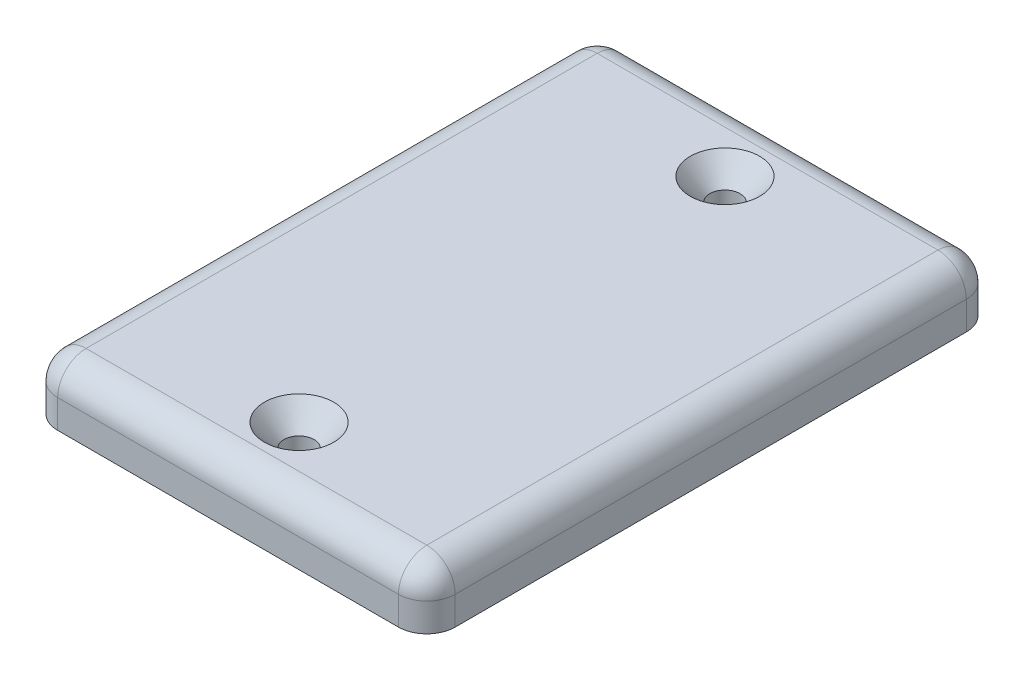
ISO-10303-21;
HEADER;
FILE_DESCRIPTION(('STEP AP214'),'2;1');
FILE_NAME('part.step','',(''),(''),'','','');
FILE_SCHEMA(('AUTOMOTIVE_DESIGN { 1 0 10303 214 1 1 1 1 }'));
ENDSEC;
DATA;
#1=APPLICATION_CONTEXT('core data for automotive mechanical design processes');
#2=APPLICATION_PROTOCOL_DEFINITION('international standard','automotive_design',2000,#1);
#3=PRODUCT_CONTEXT('',#1,'mechanical');
#4=PRODUCT('Part','Part','',(#3));
#5=PRODUCT_RELATED_PRODUCT_CATEGORY('part','',(#4));
#6=PRODUCT_DEFINITION_FORMATION('','',#4);
#7=PRODUCT_DEFINITION_CONTEXT('part definition',#1,'design');
#8=PRODUCT_DEFINITION('design','',#6,#7);
#9=PRODUCT_DEFINITION_SHAPE('','',#8);
#10=(LENGTH_UNIT() NAMED_UNIT(*) SI_UNIT(.MILLI.,.METRE.));
#11=(NAMED_UNIT(*) PLANE_ANGLE_UNIT() SI_UNIT($,.RADIAN.));
#12=(NAMED_UNIT(*) SI_UNIT($,.STERADIAN.) SOLID_ANGLE_UNIT());
#13=UNCERTAINTY_MEASURE_WITH_UNIT(LENGTH_MEASURE(1.E-05),#10,'distance_accuracy_value','');
#14=(GEOMETRIC_REPRESENTATION_CONTEXT(3) GLOBAL_UNCERTAINTY_ASSIGNED_CONTEXT((#13)) GLOBAL_UNIT_ASSIGNED_CONTEXT((#10,
#11,#12)) REPRESENTATION_CONTEXT('',''));
#15=CARTESIAN_POINT('',(0.,0.,0.));
#16=DIRECTION('',(0.,0.,1.));
#17=DIRECTION('',(1.,0.,0.));
#18=AXIS2_PLACEMENT_3D('',#15,#16,#17);
#19=CARTESIAN_POINT('',(0.,12.7,0.));
#20=DIRECTION('',(1.,0.,0.));
#21=DIRECTION('',(0.,0.,-1.));
#22=AXIS2_PLACEMENT_3D('',#19,#20,#21);
#23=PLANE('',#22);
#24=DIRECTION('',(0.,-1.,0.));
#25=VECTOR('',#24,1.);
#26=CARTESIAN_POINT('',(0.,12.7,-6.35));
#27=LINE('',#26,#25);
#28=CARTESIAN_POINT('',(0.,0.,-6.35));
#29=VERTEX_POINT('',#28);
#30=CARTESIAN_POINT('',(0.,6.35,-6.35));
#31=VERTEX_POINT('',#30);
#32=EDGE_CURVE('E130',#29,#31,#27,.F.);
#33=ORIENTED_EDGE('',*,*,#32,.T.);
#34=DIRECTION('',(0.,0.,1.));
#35=VECTOR('',#34,1.);
#36=CARTESIAN_POINT('',(0.,6.35,0.));
#37=LINE('',#36,#35);
#38=CARTESIAN_POINT('',(0.,6.35,-120.65));
#39=VERTEX_POINT('',#38);
#40=EDGE_CURVE('E58',#31,#39,#37,.F.);
#41=ORIENTED_EDGE('',*,*,#40,.T.);
#42=DIRECTION('',(0.,-1.,0.));
#43=VECTOR('',#42,1.);
#44=CARTESIAN_POINT('',(0.,12.7,-120.65));
#45=LINE('',#44,#43);
#46=CARTESIAN_POINT('',(0.,0.,-120.65));
#47=VERTEX_POINT('',#46);
#48=EDGE_CURVE('E134',#39,#47,#45,.T.);
#49=ORIENTED_EDGE('',*,*,#48,.T.);
#50=DIRECTION('',(0.,0.,1.));
#51=VECTOR('',#50,1.);
#52=CARTESIAN_POINT('',(0.,0.,0.));
#53=LINE('',#52,#51);
#54=EDGE_CURVE('E142',#47,#29,#53,.T.);
#55=ORIENTED_EDGE('',*,*,#54,.T.);
#56=EDGE_LOOP('',(#33,#41,#49,#55));
#57=FACE_BOUND('',#56,.T.);
#58=ADVANCED_FACE('F34',(#57),#23,.F.);
#59=CARTESIAN_POINT('',(0.,12.7,0.));
#60=DIRECTION('',(0.,0.,-1.));
#61=DIRECTION('',(-1.,0.,0.));
#62=AXIS2_PLACEMENT_3D('',#59,#60,#61);
#63=PLANE('',#62);
#64=DIRECTION('',(0.,-1.,0.));
#65=VECTOR('',#64,1.);
#66=CARTESIAN_POINT('',(82.55,12.7,0.));
#67=LINE('',#66,#65);
#68=CARTESIAN_POINT('',(82.55,0.,0.));
#69=VERTEX_POINT('',#68);
#70=CARTESIAN_POINT('',(82.55,6.35,0.));
#71=VERTEX_POINT('',#70);
#72=EDGE_CURVE('E125',#69,#71,#67,.F.);
#73=ORIENTED_EDGE('',*,*,#72,.T.);
#74=DIRECTION('',(1.,0.,0.));
#75=VECTOR('',#74,1.);
#76=CARTESIAN_POINT('',(0.,6.35,0.));
#77=LINE('',#76,#75);
#78=CARTESIAN_POINT('',(6.35,6.35,0.));
#79=VERTEX_POINT('',#78);
#80=EDGE_CURVE('E121',#71,#79,#77,.F.);
#81=ORIENTED_EDGE('',*,*,#80,.T.);
#82=DIRECTION('',(0.,-1.,0.));
#83=VECTOR('',#82,1.);
#84=CARTESIAN_POINT('',(6.35,12.7,0.));
#85=LINE('',#84,#83);
#86=CARTESIAN_POINT('',(6.35,0.,0.));
#87=VERTEX_POINT('',#86);
#88=EDGE_CURVE('E113',#79,#87,#85,.T.);
#89=ORIENTED_EDGE('',*,*,#88,.T.);
#90=DIRECTION('',(1.,0.,0.));
#91=VECTOR('',#90,1.);
#92=CARTESIAN_POINT('',(0.,0.,0.));
#93=LINE('',#92,#91);
#94=EDGE_CURVE('E118',#87,#69,#93,.T.);
#95=ORIENTED_EDGE('',*,*,#94,.T.);
#96=EDGE_LOOP('',(#73,#81,#89,#95));
#97=FACE_BOUND('',#96,.T.);
#98=ADVANCED_FACE('F116',(#97),#63,.F.);
#99=CARTESIAN_POINT('',(88.9,12.7,0.));
#100=DIRECTION('',(-1.,0.,0.));
#101=DIRECTION('',(0.,0.,1.));
#102=AXIS2_PLACEMENT_3D('',#99,#100,#101);
#103=PLANE('',#102);
#104=DIRECTION('',(0.,-1.,0.));
#105=VECTOR('',#104,1.);
#106=CARTESIAN_POINT('',(88.9,12.7,-120.65));
#107=LINE('',#106,#105);
#108=CARTESIAN_POINT('',(88.9,0.,-120.65));
#109=VERTEX_POINT('',#108);
#110=CARTESIAN_POINT('',(88.9,6.35,-120.65));
#111=VERTEX_POINT('',#110);
#112=EDGE_CURVE('E163',#109,#111,#107,.F.);
#113=ORIENTED_EDGE('',*,*,#112,.T.);
#114=DIRECTION('',(0.,0.,-1.));
#115=VECTOR('',#114,1.);
#116=CARTESIAN_POINT('',(88.9,6.35,0.));
#117=LINE('',#116,#115);
#118=CARTESIAN_POINT('',(88.9,6.35,-6.35));
#119=VERTEX_POINT('',#118);
#120=EDGE_CURVE('E180',#111,#119,#117,.F.);
#121=ORIENTED_EDGE('',*,*,#120,.T.);
#122=DIRECTION('',(0.,-1.,0.));
#123=VECTOR('',#122,1.);
#124=CARTESIAN_POINT('',(88.9,12.7,-6.35));
#125=LINE('',#124,#123);
#126=CARTESIAN_POINT('',(88.9,0.,-6.35));
#127=VERTEX_POINT('',#126);
#128=EDGE_CURVE('E166',#119,#127,#125,.T.);
#129=ORIENTED_EDGE('',*,*,#128,.T.);
#130=DIRECTION('',(0.,0.,-1.));
#131=VECTOR('',#130,1.);
#132=CARTESIAN_POINT('',(88.9,0.,0.));
#133=LINE('',#132,#131);
#134=EDGE_CURVE('E141',#127,#109,#133,.T.);
#135=ORIENTED_EDGE('',*,*,#134,.T.);
#136=EDGE_LOOP('',(#113,#121,#129,#135));
#137=FACE_BOUND('',#136,.T.);
#138=ADVANCED_FACE('F258',(#137),#103,.F.);
#139=CARTESIAN_POINT('',(0.,12.7,-127.));
#140=DIRECTION('',(0.,0.,1.));
#141=DIRECTION('',(1.,0.,0.));
#142=AXIS2_PLACEMENT_3D('',#139,#140,#141);
#143=PLANE('',#142);
#144=DIRECTION('',(0.,-1.,0.));
#145=VECTOR('',#144,1.);
#146=CARTESIAN_POINT('',(6.35,12.7,-127.));
#147=LINE('',#146,#145);
#148=CARTESIAN_POINT('',(6.35,0.,-127.));
#149=VERTEX_POINT('',#148);
#150=CARTESIAN_POINT('',(6.35,6.35,-127.));
#151=VERTEX_POINT('',#150);
#152=EDGE_CURVE('E161',#149,#151,#147,.F.);
#153=ORIENTED_EDGE('',*,*,#152,.T.);
#154=DIRECTION('',(-1.,0.,0.));
#155=VECTOR('',#154,1.);
#156=CARTESIAN_POINT('',(0.,6.35,-127.));
#157=LINE('',#156,#155);
#158=CARTESIAN_POINT('',(82.55,6.35,-127.));
#159=VERTEX_POINT('',#158);
#160=EDGE_CURVE('E11',#151,#159,#157,.F.);
#161=ORIENTED_EDGE('',*,*,#160,.T.);
#162=DIRECTION('',(0.,-1.,0.));
#163=VECTOR('',#162,1.);
#164=CARTESIAN_POINT('',(82.55,12.7,-127.));
#165=LINE('',#164,#163);
#166=CARTESIAN_POINT('',(82.55,0.,-127.));
#167=VERTEX_POINT('',#166);
#168=EDGE_CURVE('E159',#159,#167,#165,.T.);
#169=ORIENTED_EDGE('',*,*,#168,.T.);
#170=DIRECTION('',(-1.,0.,0.));
#171=VECTOR('',#170,1.);
#172=CARTESIAN_POINT('',(0.,0.,-127.));
#173=LINE('',#172,#171);
#174=EDGE_CURVE('E145',#167,#149,#173,.T.);
#175=ORIENTED_EDGE('',*,*,#174,.T.);
#176=EDGE_LOOP('',(#153,#161,#169,#175));
#177=FACE_BOUND('',#176,.T.);
#178=ADVANCED_FACE('F249',(#177),#143,.F.);
#179=CARTESIAN_POINT('',(0.,12.7,0.));
#180=DIRECTION('',(0.,-1.,0.));
#181=DIRECTION('',(0.,0.,-1.));
#182=AXIS2_PLACEMENT_3D('',#179,#180,#181);
#183=PLANE('',#182);
#184=DIRECTION('',(1.,0.,0.));
#185=VECTOR('',#184,1.);
#186=CARTESIAN_POINT('',(0.,12.7,-6.35));
#187=LINE('',#186,#185);
#188=CARTESIAN_POINT('',(6.35,12.7,-6.35));
#189=VERTEX_POINT('',#188);
#190=CARTESIAN_POINT('',(82.55,12.7,-6.35));
#191=VERTEX_POINT('',#190);
#192=EDGE_CURVE('E175',#189,#191,#187,.T.);
#193=ORIENTED_EDGE('',*,*,#192,.T.);
#194=DIRECTION('',(0.,0.,-1.));
#195=VECTOR('',#194,1.);
#196=CARTESIAN_POINT('',(82.55,12.7,0.));
#197=LINE('',#196,#195);
#198=CARTESIAN_POINT('',(82.55,12.7,-120.65));
#199=VERTEX_POINT('',#198);
#200=EDGE_CURVE('E177',#191,#199,#197,.T.);
#201=ORIENTED_EDGE('',*,*,#200,.T.);
#202=DIRECTION('',(-1.,0.,0.));
#203=VECTOR('',#202,1.);
#204=CARTESIAN_POINT('',(0.,12.7,-120.65));
#205=LINE('',#204,#203);
#206=CARTESIAN_POINT('',(6.35,12.7,-120.65));
#207=VERTEX_POINT('',#206);
#208=EDGE_CURVE('E171',#199,#207,#205,.T.);
#209=ORIENTED_EDGE('',*,*,#208,.T.);
#210=DIRECTION('',(0.,0.,1.));
#211=VECTOR('',#210,1.);
#212=CARTESIAN_POINT('',(6.35,12.7,0.));
#213=LINE('',#212,#211);
#214=EDGE_CURVE('E173',#207,#189,#213,.T.);
#215=ORIENTED_EDGE('',*,*,#214,.T.);
#216=EDGE_LOOP('',(#193,#201,#209,#215));
#217=FACE_BOUND('',#216,.T.);
#218=CARTESIAN_POINT('',(44.45,12.7,-111.125));
#219=DIRECTION('',(0.,1.,0.));
#220=DIRECTION('',(0.,0.,1.));
#221=AXIS2_PLACEMENT_3D('',#218,#219,#220);
#222=CIRCLE('',#221,7.7636878);
#223=CARTESIAN_POINT('',(44.45,12.7,-103.3613122));
#224=VERTEX_POINT('',#223);
#225=EDGE_CURVE('E211',#224,#224,#222,.T.);
#226=ORIENTED_EDGE('',*,*,#225,.F.);
#227=EDGE_LOOP('',(#226));
#228=FACE_BOUND('',#227,.T.);
#229=CARTESIAN_POINT('',(44.45,12.7,-15.875));
#230=DIRECTION('',(0.,1.,0.));
#231=DIRECTION('',(0.,0.,1.));
#232=AXIS2_PLACEMENT_3D('',#229,#230,#231);
#233=CIRCLE('',#232,7.7636878);
#234=CARTESIAN_POINT('',(44.45,12.7,-8.11131220000001));
#235=VERTEX_POINT('',#234);
#236=EDGE_CURVE('E225',#235,#235,#233,.T.);
#237=ORIENTED_EDGE('',*,*,#236,.F.);
#238=EDGE_LOOP('',(#237));
#239=FACE_BOUND('',#238,.T.);
#240=ADVANCED_FACE('F247',(#217,#228,#239),#183,.F.);
#241=CARTESIAN_POINT('',(0.,0.,0.));
#242=DIRECTION('',(0.,-1.,0.));
#243=DIRECTION('',(0.,0.,-1.));
#244=AXIS2_PLACEMENT_3D('',#241,#242,#243);
#245=PLANE('',#244);
#246=CARTESIAN_POINT('',(44.45,0.,-111.125));
#247=DIRECTION('',(0.,1.,0.));
#248=DIRECTION('',(0.,0.,1.));
#249=AXIS2_PLACEMENT_3D('',#246,#247,#248);
#250=CIRCLE('',#249,3.3782);
#251=CARTESIAN_POINT('',(44.45,0.,-107.7468));
#252=VERTEX_POINT('',#251);
#253=EDGE_CURVE('E220',#252,#252,#250,.T.);
#254=ORIENTED_EDGE('',*,*,#253,.T.);
#255=EDGE_LOOP('',(#254));
#256=FACE_BOUND('',#255,.T.);
#257=CARTESIAN_POINT('',(44.45,0.,-15.875));
#258=DIRECTION('',(0.,1.,0.));
#259=DIRECTION('',(0.,0.,1.));
#260=AXIS2_PLACEMENT_3D('',#257,#258,#259);
#261=CIRCLE('',#260,3.3782);
#262=CARTESIAN_POINT('',(44.45,0.,-12.4968));
#263=VERTEX_POINT('',#262);
#264=EDGE_CURVE('E147',#263,#263,#261,.T.);
#265=ORIENTED_EDGE('',*,*,#264,.T.);
#266=EDGE_LOOP('',(#265));
#267=FACE_BOUND('',#266,.T.);
#268=ORIENTED_EDGE('',*,*,#94,.F.);
#269=CARTESIAN_POINT('',(6.35,0.,-6.35));
#270=DIRECTION('',(0.,-1.,0.));
#271=DIRECTION('',(0.,0.,-1.));
#272=AXIS2_PLACEMENT_3D('',#269,#270,#271);
#273=CIRCLE('',#272,6.35);
#274=EDGE_CURVE('E128',#87,#29,#273,.T.);
#275=ORIENTED_EDGE('',*,*,#274,.T.);
#276=ORIENTED_EDGE('',*,*,#54,.F.);
#277=CARTESIAN_POINT('',(6.35,0.,-120.65));
#278=DIRECTION('',(0.,-1.,0.));
#279=DIRECTION('',(0.,0.,-1.));
#280=AXIS2_PLACEMENT_3D('',#277,#278,#279);
#281=CIRCLE('',#280,6.35);
#282=EDGE_CURVE('E135',#47,#149,#281,.T.);
#283=ORIENTED_EDGE('',*,*,#282,.T.);
#284=ORIENTED_EDGE('',*,*,#174,.F.);
#285=CARTESIAN_POINT('',(82.55,0.,-120.65));
#286=DIRECTION('',(0.,-1.,0.));
#287=DIRECTION('',(0.,0.,-1.));
#288=AXIS2_PLACEMENT_3D('',#285,#286,#287);
#289=CIRCLE('',#288,6.35);
#290=EDGE_CURVE('E124',#167,#109,#289,.T.);
#291=ORIENTED_EDGE('',*,*,#290,.T.);
#292=ORIENTED_EDGE('',*,*,#134,.F.);
#293=CARTESIAN_POINT('',(82.55,0.,-6.35));
#294=DIRECTION('',(0.,-1.,0.));
#295=DIRECTION('',(0.,0.,-1.));
#296=AXIS2_PLACEMENT_3D('',#293,#294,#295);
#297=CIRCLE('',#296,6.35);
#298=EDGE_CURVE('E140',#127,#69,#297,.T.);
#299=ORIENTED_EDGE('',*,*,#298,.T.);
#300=EDGE_LOOP('',(#268,#275,#276,#283,#284,#291,#292,#299));
#301=FACE_BOUND('',#300,.T.);
#302=ADVANCED_FACE('F137',(#256,#267,#301),#245,.T.);
#303=CARTESIAN_POINT('',(44.45,12.7,-15.875));
#304=DIRECTION('',(0.,1.,0.));
#305=DIRECTION('',(0.,0.,1.));
#306=AXIS2_PLACEMENT_3D('',#303,#304,#305);
#307=CYLINDRICAL_SURFACE('',#306,3.3782);
#308=ORIENTED_EDGE('',*,*,#264,.F.);
#309=EDGE_LOOP('',(#308));
#310=FACE_BOUND('',#309,.T.);
#311=CARTESIAN_POINT('',(44.45,7.65507338462683,-15.875));
#312=DIRECTION('',(0.,1.,0.));
#313=DIRECTION('',(0.,0.,1.));
#314=AXIS2_PLACEMENT_3D('',#311,#312,#313);
#315=CIRCLE('',#314,3.3782);
#316=CARTESIAN_POINT('',(44.45,7.65507338462683,-12.4968));
#317=VERTEX_POINT('',#316);
#318=EDGE_CURVE('E228',#317,#317,#315,.T.);
#319=ORIENTED_EDGE('',*,*,#318,.T.);
#320=EDGE_LOOP('',(#319));
#321=FACE_BOUND('',#320,.T.);
#322=ADVANCED_FACE('F234',(#310,#321),#307,.F.);
#323=CARTESIAN_POINT('',(44.45,12.7,-15.875));
#324=DIRECTION('',(0.,1.,0.));
#325=DIRECTION('',(0.,0.,1.));
#326=AXIS2_PLACEMENT_3D('',#323,#324,#325);
#327=CONICAL_SURFACE('',#326,7.7636878,0.715584993317676);
#328=ORIENTED_EDGE('',*,*,#318,.F.);
#329=EDGE_LOOP('',(#328));
#330=FACE_BOUND('',#329,.T.);
#331=ORIENTED_EDGE('',*,*,#236,.T.);
#332=EDGE_LOOP('',(#331));
#333=FACE_BOUND('',#332,.T.);
#334=ADVANCED_FACE('F237',(#330,#333),#327,.F.);
#335=CARTESIAN_POINT('',(44.45,12.7,-111.125));
#336=DIRECTION('',(0.,1.,0.));
#337=DIRECTION('',(0.,0.,1.));
#338=AXIS2_PLACEMENT_3D('',#335,#336,#337);
#339=CYLINDRICAL_SURFACE('',#338,3.3782);
#340=ORIENTED_EDGE('',*,*,#253,.F.);
#341=EDGE_LOOP('',(#340));
#342=FACE_BOUND('',#341,.T.);
#343=CARTESIAN_POINT('',(44.45,7.65507338462683,-111.125));
#344=DIRECTION('',(0.,1.,0.));
#345=DIRECTION('',(0.,0.,1.));
#346=AXIS2_PLACEMENT_3D('',#343,#344,#345);
#347=CIRCLE('',#346,3.3782);
#348=CARTESIAN_POINT('',(44.45,7.65507338462683,-107.7468));
#349=VERTEX_POINT('',#348);
#350=EDGE_CURVE('E215',#349,#349,#347,.T.);
#351=ORIENTED_EDGE('',*,*,#350,.T.);
#352=EDGE_LOOP('',(#351));
#353=FACE_BOUND('',#352,.T.);
#354=ADVANCED_FACE('F243',(#342,#353),#339,.F.);
#355=CARTESIAN_POINT('',(44.45,12.7,-111.125));
#356=DIRECTION('',(0.,1.,0.));
#357=DIRECTION('',(0.,0.,1.));
#358=AXIS2_PLACEMENT_3D('',#355,#356,#357);
#359=CONICAL_SURFACE('',#358,7.7636878,0.715584993317676);
#360=ORIENTED_EDGE('',*,*,#350,.F.);
#361=EDGE_LOOP('',(#360));
#362=FACE_BOUND('',#361,.T.);
#363=ORIENTED_EDGE('',*,*,#225,.T.);
#364=EDGE_LOOP('',(#363));
#365=FACE_BOUND('',#364,.T.);
#366=ADVANCED_FACE('F273',(#362,#365),#359,.F.);
#367=CARTESIAN_POINT('',(6.35,12.7,-6.35));
#368=DIRECTION('',(0.,-1.,0.));
#369=DIRECTION('',(0.,0.,-1.));
#370=AXIS2_PLACEMENT_3D('',#367,#368,#369);
#371=CYLINDRICAL_SURFACE('',#370,6.35);
#372=ORIENTED_EDGE('',*,*,#88,.F.);
#373=CARTESIAN_POINT('',(6.35,6.35,-6.35));
#374=DIRECTION('',(0.,-1.,0.));
#375=DIRECTION('',(0.,0.,-1.));
#376=AXIS2_PLACEMENT_3D('',#373,#374,#375);
#377=CIRCLE('',#376,6.35);
#378=EDGE_CURVE('E185',#79,#31,#377,.T.);
#379=ORIENTED_EDGE('',*,*,#378,.T.);
#380=ORIENTED_EDGE('',*,*,#32,.F.);
#381=ORIENTED_EDGE('',*,*,#274,.F.);
#382=EDGE_LOOP('',(#372,#379,#380,#381));
#383=FACE_BOUND('',#382,.T.);
#384=ADVANCED_FACE('F129',(#383),#371,.T.);
#385=CARTESIAN_POINT('',(6.35,12.7,-120.65));
#386=DIRECTION('',(0.,-1.,0.));
#387=DIRECTION('',(0.,0.,-1.));
#388=AXIS2_PLACEMENT_3D('',#385,#386,#387);
#389=CYLINDRICAL_SURFACE('',#388,6.35);
#390=ORIENTED_EDGE('',*,*,#48,.F.);
#391=CARTESIAN_POINT('',(6.35,6.35,-120.65));
#392=DIRECTION('',(0.,-1.,0.));
#393=DIRECTION('',(0.,0.,-1.));
#394=AXIS2_PLACEMENT_3D('',#391,#392,#393);
#395=CIRCLE('',#394,6.35);
#396=EDGE_CURVE('E43',#39,#151,#395,.T.);
#397=ORIENTED_EDGE('',*,*,#396,.T.);
#398=ORIENTED_EDGE('',*,*,#152,.F.);
#399=ORIENTED_EDGE('',*,*,#282,.F.);
#400=EDGE_LOOP('',(#390,#397,#398,#399));
#401=FACE_BOUND('',#400,.T.);
#402=ADVANCED_FACE('F272',(#401),#389,.T.);
#403=CARTESIAN_POINT('',(82.55,12.7,-6.35));
#404=DIRECTION('',(0.,-1.,0.));
#405=DIRECTION('',(0.,0.,-1.));
#406=AXIS2_PLACEMENT_3D('',#403,#404,#405);
#407=CYLINDRICAL_SURFACE('',#406,6.35);
#408=ORIENTED_EDGE('',*,*,#128,.F.);
#409=CARTESIAN_POINT('',(82.55,6.35,-6.35));
#410=DIRECTION('',(0.,-1.,0.));
#411=DIRECTION('',(0.,0.,-1.));
#412=AXIS2_PLACEMENT_3D('',#409,#410,#411);
#413=CIRCLE('',#412,6.35);
#414=EDGE_CURVE('E182',#119,#71,#413,.T.);
#415=ORIENTED_EDGE('',*,*,#414,.T.);
#416=ORIENTED_EDGE('',*,*,#72,.F.);
#417=ORIENTED_EDGE('',*,*,#298,.F.);
#418=EDGE_LOOP('',(#408,#415,#416,#417));
#419=FACE_BOUND('',#418,.T.);
#420=ADVANCED_FACE('F276',(#419),#407,.T.);
#421=CARTESIAN_POINT('',(82.55,12.7,-120.65));
#422=DIRECTION('',(0.,-1.,0.));
#423=DIRECTION('',(0.,0.,-1.));
#424=AXIS2_PLACEMENT_3D('',#421,#422,#423);
#425=CYLINDRICAL_SURFACE('',#424,6.35);
#426=ORIENTED_EDGE('',*,*,#168,.F.);
#427=CARTESIAN_POINT('',(82.55,6.35,-120.65));
#428=DIRECTION('',(0.,-1.,0.));
#429=DIRECTION('',(0.,0.,-1.));
#430=AXIS2_PLACEMENT_3D('',#427,#428,#429);
#431=CIRCLE('',#430,6.35);
#432=EDGE_CURVE('E168',#159,#111,#431,.T.);
#433=ORIENTED_EDGE('',*,*,#432,.T.);
#434=ORIENTED_EDGE('',*,*,#112,.F.);
#435=ORIENTED_EDGE('',*,*,#290,.F.);
#436=EDGE_LOOP('',(#426,#433,#434,#435));
#437=FACE_BOUND('',#436,.T.);
#438=ADVANCED_FACE('F279',(#437),#425,.T.);
#439=CARTESIAN_POINT('',(6.35,6.35,-6.35));
#440=DIRECTION('',(0.,-1.,0.));
#441=DIRECTION('',(0.,0.,-1.));
#442=AXIS2_PLACEMENT_3D('',#439,#440,#441);
#443=SPHERICAL_SURFACE('',#442,6.35);
#444=CARTESIAN_POINT('',(6.35,6.35,-6.35));
#445=DIRECTION('',(0.,0.,-1.));
#446=DIRECTION('',(-1.,0.,0.));
#447=AXIS2_PLACEMENT_3D('',#444,#445,#446);
#448=CIRCLE('',#447,6.35);
#449=EDGE_CURVE('E204',#31,#189,#448,.T.);
#450=ORIENTED_EDGE('',*,*,#449,.F.);
#451=ORIENTED_EDGE('',*,*,#378,.F.);
#452=CARTESIAN_POINT('',(6.35,6.35,-6.35));
#453=DIRECTION('',(1.,0.,0.));
#454=DIRECTION('',(0.,0.,-1.));
#455=AXIS2_PLACEMENT_3D('',#452,#453,#454);
#456=CIRCLE('',#455,6.35);
#457=EDGE_CURVE('E38',#189,#79,#456,.T.);
#458=ORIENTED_EDGE('',*,*,#457,.F.);
#459=EDGE_LOOP('',(#450,#451,#458));
#460=FACE_BOUND('',#459,.T.);
#461=ADVANCED_FACE('F36',(#460),#443,.T.);
#462=CARTESIAN_POINT('',(0.,6.35,-6.35));
#463=DIRECTION('',(1.,0.,0.));
#464=DIRECTION('',(0.,0.,-1.));
#465=AXIS2_PLACEMENT_3D('',#462,#463,#464);
#466=CYLINDRICAL_SURFACE('',#465,6.35);
#467=ORIENTED_EDGE('',*,*,#457,.T.);
#468=ORIENTED_EDGE('',*,*,#80,.F.);
#469=CARTESIAN_POINT('',(82.55,6.35,-6.35));
#470=DIRECTION('',(1.,0.,0.));
#471=DIRECTION('',(0.,0.,-1.));
#472=AXIS2_PLACEMENT_3D('',#469,#470,#471);
#473=CIRCLE('',#472,6.35);
#474=EDGE_CURVE('E202',#191,#71,#473,.T.);
#475=ORIENTED_EDGE('',*,*,#474,.F.);
#476=ORIENTED_EDGE('',*,*,#192,.F.);
#477=EDGE_LOOP('',(#467,#468,#475,#476));
#478=FACE_BOUND('',#477,.T.);
#479=ADVANCED_FACE('F306',(#478),#466,.T.);
#480=CARTESIAN_POINT('',(6.35,6.35,0.));
#481=DIRECTION('',(0.,0.,1.));
#482=DIRECTION('',(1.,0.,0.));
#483=AXIS2_PLACEMENT_3D('',#480,#481,#482);
#484=CYLINDRICAL_SURFACE('',#483,6.35);
#485=ORIENTED_EDGE('',*,*,#449,.T.);
#486=ORIENTED_EDGE('',*,*,#214,.F.);
#487=CARTESIAN_POINT('',(6.35,6.35,-120.65));
#488=DIRECTION('',(0.,0.,-1.));
#489=DIRECTION('',(-1.,0.,0.));
#490=AXIS2_PLACEMENT_3D('',#487,#488,#489);
#491=CIRCLE('',#490,6.35);
#492=EDGE_CURVE('E199',#39,#207,#491,.T.);
#493=ORIENTED_EDGE('',*,*,#492,.F.);
#494=ORIENTED_EDGE('',*,*,#40,.F.);
#495=EDGE_LOOP('',(#485,#486,#493,#494));
#496=FACE_BOUND('',#495,.T.);
#497=ADVANCED_FACE('F303',(#496),#484,.T.);
#498=CARTESIAN_POINT('',(82.55,6.35,-6.35));
#499=DIRECTION('',(0.,-1.,0.));
#500=DIRECTION('',(0.,0.,-1.));
#501=AXIS2_PLACEMENT_3D('',#498,#499,#500);
#502=SPHERICAL_SURFACE('',#501,6.35);
#503=ORIENTED_EDGE('',*,*,#474,.T.);
#504=ORIENTED_EDGE('',*,*,#414,.F.);
#505=CARTESIAN_POINT('',(82.55,6.35,-6.35));
#506=DIRECTION('',(0.,0.,-1.));
#507=DIRECTION('',(-1.,0.,0.));
#508=AXIS2_PLACEMENT_3D('',#505,#506,#507);
#509=CIRCLE('',#508,6.35);
#510=EDGE_CURVE('E196',#191,#119,#509,.T.);
#511=ORIENTED_EDGE('',*,*,#510,.F.);
#512=EDGE_LOOP('',(#503,#504,#511));
#513=FACE_BOUND('',#512,.T.);
#514=ADVANCED_FACE('F299',(#513),#502,.T.);
#515=CARTESIAN_POINT('',(6.35,6.35,-120.65));
#516=DIRECTION('',(0.,-1.,0.));
#517=DIRECTION('',(0.,0.,-1.));
#518=AXIS2_PLACEMENT_3D('',#515,#516,#517);
#519=SPHERICAL_SURFACE('',#518,6.35);
#520=ORIENTED_EDGE('',*,*,#396,.F.);
#521=ORIENTED_EDGE('',*,*,#492,.T.);
#522=CARTESIAN_POINT('',(6.35,6.35,-120.65));
#523=DIRECTION('',(1.,0.,0.));
#524=DIRECTION('',(0.,0.,-1.));
#525=AXIS2_PLACEMENT_3D('',#522,#523,#524);
#526=CIRCLE('',#525,6.35);
#527=EDGE_CURVE('E193',#151,#207,#526,.T.);
#528=ORIENTED_EDGE('',*,*,#527,.F.);
#529=EDGE_LOOP('',(#520,#521,#528));
#530=FACE_BOUND('',#529,.T.);
#531=ADVANCED_FACE('F295',(#530),#519,.T.);
#532=CARTESIAN_POINT('',(82.55,6.35,0.));
#533=DIRECTION('',(0.,0.,-1.));
#534=DIRECTION('',(-1.,0.,0.));
#535=AXIS2_PLACEMENT_3D('',#532,#533,#534);
#536=CYLINDRICAL_SURFACE('',#535,6.35);
#537=ORIENTED_EDGE('',*,*,#510,.T.);
#538=ORIENTED_EDGE('',*,*,#120,.F.);
#539=CARTESIAN_POINT('',(82.55,6.35,-120.65));
#540=DIRECTION('',(0.,0.,-1.));
#541=DIRECTION('',(-1.,0.,0.));
#542=AXIS2_PLACEMENT_3D('',#539,#540,#541);
#543=CIRCLE('',#542,6.35);
#544=EDGE_CURVE('E191',#199,#111,#543,.T.);
#545=ORIENTED_EDGE('',*,*,#544,.F.);
#546=ORIENTED_EDGE('',*,*,#200,.F.);
#547=EDGE_LOOP('',(#537,#538,#545,#546));
#548=FACE_BOUND('',#547,.T.);
#549=ADVANCED_FACE('F291',(#548),#536,.T.);
#550=CARTESIAN_POINT('',(0.,6.35,-120.65));
#551=DIRECTION('',(-1.,0.,0.));
#552=DIRECTION('',(0.,0.,1.));
#553=AXIS2_PLACEMENT_3D('',#550,#551,#552);
#554=CYLINDRICAL_SURFACE('',#553,6.35);
#555=ORIENTED_EDGE('',*,*,#527,.T.);
#556=ORIENTED_EDGE('',*,*,#208,.F.);
#557=CARTESIAN_POINT('',(82.55,6.35,-120.65));
#558=DIRECTION('',(1.,0.,0.));
#559=DIRECTION('',(0.,0.,-1.));
#560=AXIS2_PLACEMENT_3D('',#557,#558,#559);
#561=CIRCLE('',#560,6.35);
#562=EDGE_CURVE('E189',#159,#199,#561,.T.);
#563=ORIENTED_EDGE('',*,*,#562,.F.);
#564=ORIENTED_EDGE('',*,*,#160,.F.);
#565=EDGE_LOOP('',(#555,#556,#563,#564));
#566=FACE_BOUND('',#565,.T.);
#567=ADVANCED_FACE('F287',(#566),#554,.T.);
#568=CARTESIAN_POINT('',(82.55,6.35,-120.65));
#569=DIRECTION('',(0.,-1.,0.));
#570=DIRECTION('',(0.,0.,-1.));
#571=AXIS2_PLACEMENT_3D('',#568,#569,#570);
#572=SPHERICAL_SURFACE('',#571,6.35);
#573=ORIENTED_EDGE('',*,*,#544,.T.);
#574=ORIENTED_EDGE('',*,*,#432,.F.);
#575=ORIENTED_EDGE('',*,*,#562,.T.);
#576=EDGE_LOOP('',(#573,#574,#575));
#577=FACE_BOUND('',#576,.T.);
#578=ADVANCED_FACE('F284',(#577),#572,.T.);
#579=CLOSED_SHELL('',(#58,#98,#138,#178,#240,#302,#322,#334,#354,#366,#384,#402,#420,#438,#461,
#479,#497,#514,#531,#549,#567,#578));
#580=MANIFOLD_SOLID_BREP('B2',#579);
#581=ADVANCED_BREP_SHAPE_REPRESENTATION('',(#18,#580),#14);
#582=SHAPE_DEFINITION_REPRESENTATION(#9,#581);
ENDSEC;
END-ISO-10303-21;
